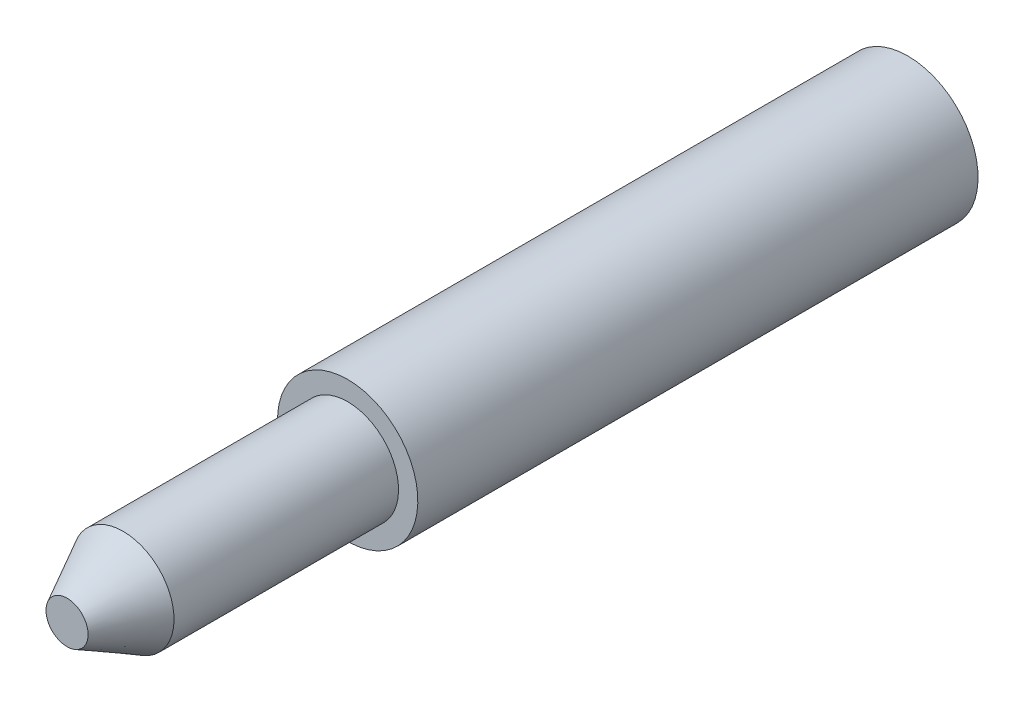
ISO-10303-21;
HEADER;
FILE_DESCRIPTION(('STEP AP214'),'2;1');
FILE_NAME('part.step','',(''),(''),'','','');
FILE_SCHEMA(('AUTOMOTIVE_DESIGN { 1 0 10303 214 1 1 1 1 }'));
ENDSEC;
DATA;
#1=APPLICATION_CONTEXT('core data for automotive mechanical design processes');
#2=APPLICATION_PROTOCOL_DEFINITION('international standard','automotive_design',2000,#1);
#3=PRODUCT_CONTEXT('',#1,'mechanical');
#4=PRODUCT('Part','Part','',(#3));
#5=PRODUCT_RELATED_PRODUCT_CATEGORY('part','',(#4));
#6=PRODUCT_DEFINITION_FORMATION('','',#4);
#7=PRODUCT_DEFINITION_CONTEXT('part definition',#1,'design');
#8=PRODUCT_DEFINITION('design','',#6,#7);
#9=PRODUCT_DEFINITION_SHAPE('','',#8);
#10=(LENGTH_UNIT() NAMED_UNIT(*) SI_UNIT(.MILLI.,.METRE.));
#11=(NAMED_UNIT(*) PLANE_ANGLE_UNIT() SI_UNIT($,.RADIAN.));
#12=(NAMED_UNIT(*) SI_UNIT($,.STERADIAN.) SOLID_ANGLE_UNIT());
#13=UNCERTAINTY_MEASURE_WITH_UNIT(LENGTH_MEASURE(1.E-05),#10,'distance_accuracy_value','');
#14=(GEOMETRIC_REPRESENTATION_CONTEXT(3) GLOBAL_UNCERTAINTY_ASSIGNED_CONTEXT((#13)) GLOBAL_UNIT_ASSIGNED_CONTEXT((#10,
#11,#12)) REPRESENTATION_CONTEXT('',''));
#15=CARTESIAN_POINT('',(0.,0.,0.));
#16=DIRECTION('',(0.,0.,1.));
#17=DIRECTION('',(1.,0.,0.));
#18=AXIS2_PLACEMENT_3D('',#15,#16,#17);
#19=CARTESIAN_POINT('',(0.,0.,5.071));
#20=DIRECTION('',(0.,0.,-1.));
#21=DIRECTION('',(0.,1.,0.));
#22=AXIS2_PLACEMENT_3D('',#19,#20,#21);
#23=CYLINDRICAL_SURFACE('',#22,0.635);
#24=CARTESIAN_POINT('',(0.,0.,5.071));
#25=DIRECTION('',(0.,0.,-1.));
#26=DIRECTION('',(0.,1.,0.));
#27=AXIS2_PLACEMENT_3D('',#24,#25,#26);
#28=CIRCLE('',#27,0.635);
#29=CARTESIAN_POINT('',(0.,0.635000000000003,5.071));
#30=VERTEX_POINT('',#29);
#31=EDGE_CURVE('E12',#30,#30,#28,.T.);
#32=ORIENTED_EDGE('',*,*,#31,.T.);
#33=EDGE_LOOP('',(#32));
#34=FACE_BOUND('',#33,.T.);
#35=CARTESIAN_POINT('',(0.,0.,-1.52308721190764E-11));
#36=DIRECTION('',(0.,0.,-1.));
#37=DIRECTION('',(-1.,0.,0.));
#38=AXIS2_PLACEMENT_3D('',#35,#36,#37);
#39=CIRCLE('',#38,0.635);
#40=CARTESIAN_POINT('',(-0.635,0.,-1.52308721190764E-11));
#41=VERTEX_POINT('',#40);
#42=EDGE_CURVE('E48',#41,#41,#39,.F.);
#43=ORIENTED_EDGE('',*,*,#42,.T.);
#44=EDGE_LOOP('',(#43));
#45=FACE_BOUND('',#44,.T.);
#46=ADVANCED_FACE('F44',(#34,#45),#23,.T.);
#47=CARTESIAN_POINT('',(0.,0.,7.611));
#48=DIRECTION('',(0.,0.,-1.));
#49=DIRECTION('',(0.,1.,0.));
#50=AXIS2_PLACEMENT_3D('',#47,#48,#49);
#51=PLANE('',#50);
#52=CARTESIAN_POINT('',(0.,0.,7.6109999999403));
#53=DIRECTION('',(0.,0.,-1.));
#54=DIRECTION('',(-1.,0.,0.));
#55=AXIS2_PLACEMENT_3D('',#52,#53,#54);
#56=CIRCLE('',#55,0.190499999977334);
#57=CARTESIAN_POINT('',(-0.190499999977334,0.,7.6109999999403));
#58=VERTEX_POINT('',#57);
#59=EDGE_CURVE('E60',#58,#58,#56,.T.);
#60=ORIENTED_EDGE('',*,*,#59,.F.);
#61=EDGE_LOOP('',(#60));
#62=FACE_BOUND('',#61,.T.);
#63=ADVANCED_FACE('F46',(#62),#51,.F.);
#64=CARTESIAN_POINT('',(0.,0.,7.10300000002917));
#65=DIRECTION('',(0.,0.,-1.));
#66=DIRECTION('',(-1.,0.,0.));
#67=AXIS2_PLACEMENT_3D('',#64,#65,#66);
#68=CONICAL_SURFACE('',#67,0.460374999931901,0.488333951059133);
#69=ORIENTED_EDGE('',*,*,#59,.T.);
#70=EDGE_LOOP('',(#69));
#71=FACE_BOUND('',#70,.T.);
#72=CARTESIAN_POINT('',(0.,0.,7.103));
#73=DIRECTION('',(0.,0.,-1.));
#74=DIRECTION('',(0.,1.,0.));
#75=AXIS2_PLACEMENT_3D('',#72,#73,#74);
#76=CIRCLE('',#75,0.460375);
#77=CARTESIAN_POINT('',(0.,0.460375000000005,7.103));
#78=VERTEX_POINT('',#77);
#79=EDGE_CURVE('E57',#78,#78,#76,.T.);
#80=ORIENTED_EDGE('',*,*,#79,.F.);
#81=EDGE_LOOP('',(#80));
#82=FACE_BOUND('',#81,.T.);
#83=ADVANCED_FACE('F81',(#71,#82),#68,.T.);
#84=CARTESIAN_POINT('',(0.,0.,7.103));
#85=DIRECTION('',(0.,0.,-1.));
#86=DIRECTION('',(0.,1.,0.));
#87=AXIS2_PLACEMENT_3D('',#84,#85,#86);
#88=CYLINDRICAL_SURFACE('',#87,0.460375);
#89=CARTESIAN_POINT('',(0.,0.,5.071));
#90=DIRECTION('',(0.,0.,-1.));
#91=DIRECTION('',(0.,1.,0.));
#92=AXIS2_PLACEMENT_3D('',#89,#90,#91);
#93=CIRCLE('',#92,0.460375);
#94=CARTESIAN_POINT('',(0.,0.460375000000003,5.071));
#95=VERTEX_POINT('',#94);
#96=EDGE_CURVE('E52',#95,#95,#93,.F.);
#97=ORIENTED_EDGE('',*,*,#96,.T.);
#98=EDGE_LOOP('',(#97));
#99=FACE_BOUND('',#98,.T.);
#100=ORIENTED_EDGE('',*,*,#79,.T.);
#101=EDGE_LOOP('',(#100));
#102=FACE_BOUND('',#101,.T.);
#103=ADVANCED_FACE('F76',(#99,#102),#88,.T.);
#104=CARTESIAN_POINT('',(0.,0.,5.071));
#105=DIRECTION('',(0.,0.,-1.));
#106=DIRECTION('',(0.,1.,0.));
#107=AXIS2_PLACEMENT_3D('',#104,#105,#106);
#108=PLANE('',#107);
#109=ORIENTED_EDGE('',*,*,#31,.F.);
#110=EDGE_LOOP('',(#109));
#111=FACE_BOUND('',#110,.T.);
#112=ORIENTED_EDGE('',*,*,#96,.F.);
#113=EDGE_LOOP('',(#112));
#114=FACE_BOUND('',#113,.T.);
#115=ADVANCED_FACE('F71',(#111,#114),#108,.F.);
#116=CARTESIAN_POINT('',(-1.61325497472888,10.,-1.52308721190764E-11));
#117=DIRECTION('',(0.,0.,-1.));
#118=DIRECTION('',(-1.,0.,0.));
#119=AXIS2_PLACEMENT_3D('',#116,#117,#118);
#120=PLANE('',#119);
#121=ORIENTED_EDGE('',*,*,#42,.F.);
#122=EDGE_LOOP('',(#121));
#123=FACE_BOUND('',#122,.T.);
#124=ADVANCED_FACE('F69',(#123),#120,.T.);
#125=CLOSED_SHELL('',(#46,#63,#83,#103,#115,#124));
#126=MANIFOLD_SOLID_BREP('B2',#125);
#127=ADVANCED_BREP_SHAPE_REPRESENTATION('',(#18,#126),#14);
#128=SHAPE_DEFINITION_REPRESENTATION(#9,#127);
ENDSEC;
END-ISO-10303-21;
